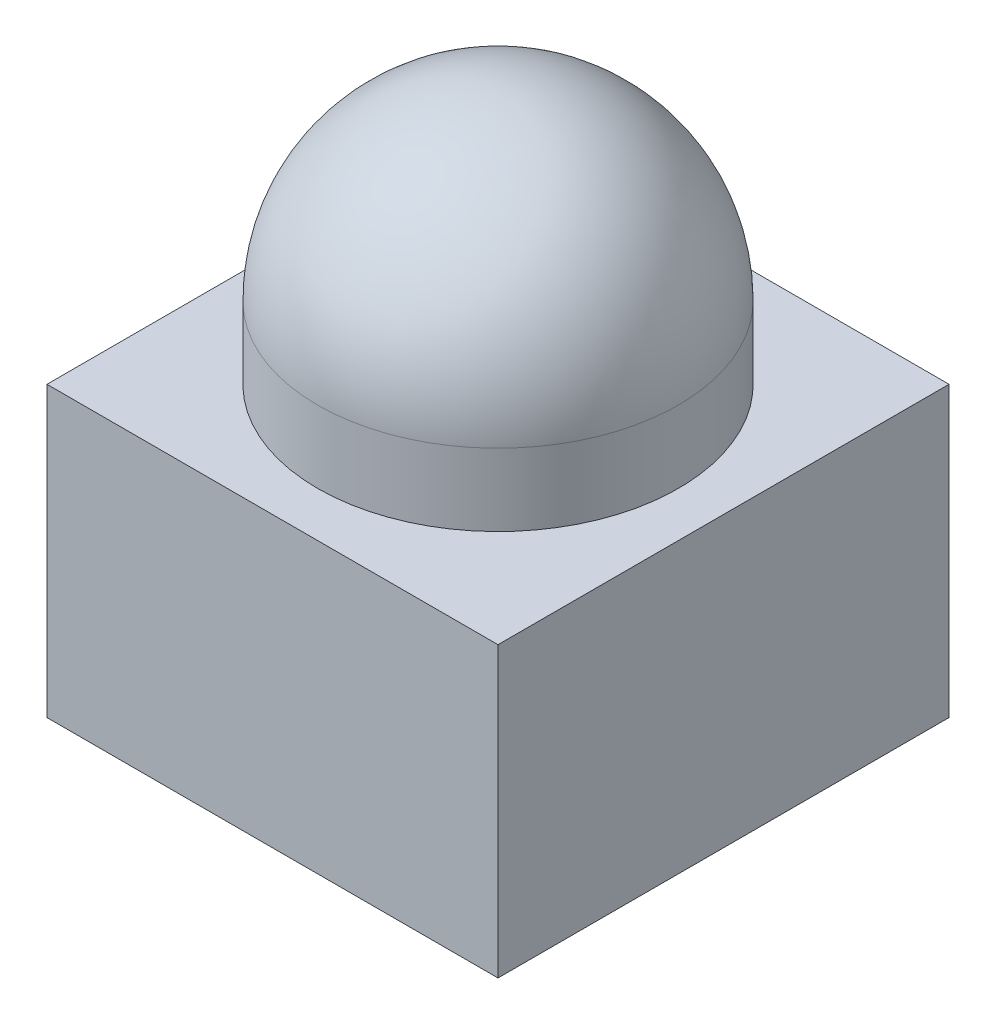
ISO-10303-21;
HEADER;
FILE_DESCRIPTION(('STEP AP214'),'2;1');
FILE_NAME('part.step','',(''),(''),'','','');
FILE_SCHEMA(('AUTOMOTIVE_DESIGN { 1 0 10303 214 1 1 1 1 }'));
ENDSEC;
DATA;
#1=APPLICATION_CONTEXT('core data for automotive mechanical design processes');
#2=APPLICATION_PROTOCOL_DEFINITION('international standard','automotive_design',2000,#1);
#3=PRODUCT_CONTEXT('',#1,'mechanical');
#4=PRODUCT('Part','Part','',(#3));
#5=PRODUCT_RELATED_PRODUCT_CATEGORY('part','',(#4));
#6=PRODUCT_DEFINITION_FORMATION('','',#4);
#7=PRODUCT_DEFINITION_CONTEXT('part definition',#1,'design');
#8=PRODUCT_DEFINITION('design','',#6,#7);
#9=PRODUCT_DEFINITION_SHAPE('','',#8);
#10=(LENGTH_UNIT() NAMED_UNIT(*) SI_UNIT(.MILLI.,.METRE.));
#11=(NAMED_UNIT(*) PLANE_ANGLE_UNIT() SI_UNIT($,.RADIAN.));
#12=(NAMED_UNIT(*) SI_UNIT($,.STERADIAN.) SOLID_ANGLE_UNIT());
#13=UNCERTAINTY_MEASURE_WITH_UNIT(LENGTH_MEASURE(1.E-05),#10,'distance_accuracy_value','');
#14=(GEOMETRIC_REPRESENTATION_CONTEXT(3) GLOBAL_UNCERTAINTY_ASSIGNED_CONTEXT((#13)) GLOBAL_UNIT_ASSIGNED_CONTEXT((#10,
#11,#12)) REPRESENTATION_CONTEXT('',''));
#15=CARTESIAN_POINT('',(0.,0.,0.));
#16=DIRECTION('',(0.,0.,1.));
#17=DIRECTION('',(1.,0.,0.));
#18=AXIS2_PLACEMENT_3D('',#15,#16,#17);
#19=CARTESIAN_POINT('',(0.,1.6,0.));
#20=DIRECTION('',(1.,0.,0.));
#21=DIRECTION('',(0.,0.,-1.));
#22=AXIS2_PLACEMENT_3D('',#19,#20,#21);
#23=PLANE('',#22);
#24=DIRECTION('',(0.,0.,1.));
#25=VECTOR('',#24,1.);
#26=CARTESIAN_POINT('',(0.,0.,0.));
#27=LINE('',#26,#25);
#28=CARTESIAN_POINT('',(0.,0.,-2.5));
#29=VERTEX_POINT('',#28);
#30=CARTESIAN_POINT('',(0.,0.,0.));
#31=VERTEX_POINT('',#30);
#32=EDGE_CURVE('E103',#29,#31,#27,.T.);
#33=ORIENTED_EDGE('',*,*,#32,.T.);
#34=DIRECTION('',(0.,-1.,0.));
#35=VECTOR('',#34,1.);
#36=CARTESIAN_POINT('',(0.,1.6,0.));
#37=LINE('',#36,#35);
#38=CARTESIAN_POINT('',(0.,1.6,0.));
#39=VERTEX_POINT('',#38);
#40=EDGE_CURVE('E94',#39,#31,#37,.T.);
#41=ORIENTED_EDGE('',*,*,#40,.F.);
#42=DIRECTION('',(0.,0.,1.));
#43=VECTOR('',#42,1.);
#44=CARTESIAN_POINT('',(0.,1.6,0.));
#45=LINE('',#44,#43);
#46=CARTESIAN_POINT('',(0.,1.6,-2.5));
#47=VERTEX_POINT('',#46);
#48=EDGE_CURVE('E88',#47,#39,#45,.T.);
#49=ORIENTED_EDGE('',*,*,#48,.F.);
#50=DIRECTION('',(0.,-1.,0.));
#51=VECTOR('',#50,1.);
#52=CARTESIAN_POINT('',(0.,1.6,-2.5));
#53=LINE('',#52,#51);
#54=EDGE_CURVE('E99',#47,#29,#53,.T.);
#55=ORIENTED_EDGE('',*,*,#54,.T.);
#56=EDGE_LOOP('',(#33,#41,#49,#55));
#57=FACE_BOUND('',#56,.T.);
#58=ADVANCED_FACE('F35',(#57),#23,.F.);
#59=CARTESIAN_POINT('',(0.,1.6,0.));
#60=DIRECTION('',(0.,0.,-1.));
#61=DIRECTION('',(-1.,0.,0.));
#62=AXIS2_PLACEMENT_3D('',#59,#60,#61);
#63=PLANE('',#62);
#64=DIRECTION('',(1.,0.,0.));
#65=VECTOR('',#64,1.);
#66=CARTESIAN_POINT('',(0.,0.,0.));
#67=LINE('',#66,#65);
#68=CARTESIAN_POINT('',(2.5,0.,0.));
#69=VERTEX_POINT('',#68);
#70=EDGE_CURVE('E93',#31,#69,#67,.T.);
#71=ORIENTED_EDGE('',*,*,#70,.T.);
#72=DIRECTION('',(0.,-1.,0.));
#73=VECTOR('',#72,1.);
#74=CARTESIAN_POINT('',(2.5,1.6,0.));
#75=LINE('',#74,#73);
#76=CARTESIAN_POINT('',(2.5,1.6,0.));
#77=VERTEX_POINT('',#76);
#78=EDGE_CURVE('E91',#77,#69,#75,.T.);
#79=ORIENTED_EDGE('',*,*,#78,.F.);
#80=DIRECTION('',(1.,0.,0.));
#81=VECTOR('',#80,1.);
#82=CARTESIAN_POINT('',(0.,1.6,0.));
#83=LINE('',#82,#81);
#84=EDGE_CURVE('E83',#39,#77,#83,.T.);
#85=ORIENTED_EDGE('',*,*,#84,.F.);
#86=ORIENTED_EDGE('',*,*,#40,.T.);
#87=EDGE_LOOP('',(#71,#79,#85,#86));
#88=FACE_BOUND('',#87,.T.);
#89=ADVANCED_FACE('F92',(#88),#63,.F.);
#90=CARTESIAN_POINT('',(2.5,1.6,0.));
#91=DIRECTION('',(-1.,0.,0.));
#92=DIRECTION('',(0.,0.,1.));
#93=AXIS2_PLACEMENT_3D('',#90,#91,#92);
#94=PLANE('',#93);
#95=DIRECTION('',(0.,0.,-1.));
#96=VECTOR('',#95,1.);
#97=CARTESIAN_POINT('',(2.5,0.,0.));
#98=LINE('',#97,#96);
#99=CARTESIAN_POINT('',(2.5,0.,-2.5));
#100=VERTEX_POINT('',#99);
#101=EDGE_CURVE('E69',#69,#100,#98,.T.);
#102=ORIENTED_EDGE('',*,*,#101,.T.);
#103=DIRECTION('',(0.,-1.,0.));
#104=VECTOR('',#103,1.);
#105=CARTESIAN_POINT('',(2.5,1.6,-2.5));
#106=LINE('',#105,#104);
#107=CARTESIAN_POINT('',(2.5,1.6,-2.5));
#108=VERTEX_POINT('',#107);
#109=EDGE_CURVE('E95',#108,#100,#106,.T.);
#110=ORIENTED_EDGE('',*,*,#109,.F.);
#111=DIRECTION('',(0.,0.,-1.));
#112=VECTOR('',#111,1.);
#113=CARTESIAN_POINT('',(2.5,1.6,0.));
#114=LINE('',#113,#112);
#115=EDGE_CURVE('E86',#77,#108,#114,.T.);
#116=ORIENTED_EDGE('',*,*,#115,.F.);
#117=ORIENTED_EDGE('',*,*,#78,.T.);
#118=EDGE_LOOP('',(#102,#110,#116,#117));
#119=FACE_BOUND('',#118,.T.);
#120=ADVANCED_FACE('F97',(#119),#94,.F.);
#121=CARTESIAN_POINT('',(0.,1.6,-2.5));
#122=DIRECTION('',(0.,0.,1.));
#123=DIRECTION('',(1.,0.,0.));
#124=AXIS2_PLACEMENT_3D('',#121,#122,#123);
#125=PLANE('',#124);
#126=DIRECTION('',(-1.,0.,0.));
#127=VECTOR('',#126,1.);
#128=CARTESIAN_POINT('',(0.,0.,-2.5));
#129=LINE('',#128,#127);
#130=EDGE_CURVE('E75',#100,#29,#129,.T.);
#131=ORIENTED_EDGE('',*,*,#130,.T.);
#132=ORIENTED_EDGE('',*,*,#54,.F.);
#133=DIRECTION('',(-1.,0.,0.));
#134=VECTOR('',#133,1.);
#135=CARTESIAN_POINT('',(0.,1.6,-2.5));
#136=LINE('',#135,#134);
#137=EDGE_CURVE('E52',#108,#47,#136,.T.);
#138=ORIENTED_EDGE('',*,*,#137,.F.);
#139=ORIENTED_EDGE('',*,*,#109,.T.);
#140=EDGE_LOOP('',(#131,#132,#138,#139));
#141=FACE_BOUND('',#140,.T.);
#142=ADVANCED_FACE('F118',(#141),#125,.F.);
#143=CARTESIAN_POINT('',(0.,1.6,0.));
#144=DIRECTION('',(0.,-1.,0.));
#145=DIRECTION('',(0.,0.,-1.));
#146=AXIS2_PLACEMENT_3D('',#143,#144,#145);
#147=PLANE('',#146);
#148=CARTESIAN_POINT('',(1.25,1.6,-1.25));
#149=DIRECTION('',(0.,1.,0.));
#150=DIRECTION('',(0.,0.,1.));
#151=AXIS2_PLACEMENT_3D('',#148,#149,#150);
#152=CIRCLE('',#151,1.);
#153=CARTESIAN_POINT('',(1.25,1.6,-0.25));
#154=VERTEX_POINT('',#153);
#155=EDGE_CURVE('E44',#154,#154,#152,.T.);
#156=ORIENTED_EDGE('',*,*,#155,.F.);
#157=EDGE_LOOP('',(#156));
#158=FACE_BOUND('',#157,.T.);
#159=ORIENTED_EDGE('',*,*,#48,.T.);
#160=ORIENTED_EDGE('',*,*,#84,.T.);
#161=ORIENTED_EDGE('',*,*,#115,.T.);
#162=ORIENTED_EDGE('',*,*,#137,.T.);
#163=EDGE_LOOP('',(#159,#160,#161,#162));
#164=FACE_BOUND('',#163,.T.);
#165=ADVANCED_FACE('F84',(#158,#164),#147,.F.);
#166=CARTESIAN_POINT('',(0.,0.,0.));
#167=DIRECTION('',(0.,-1.,0.));
#168=DIRECTION('',(0.,0.,-1.));
#169=AXIS2_PLACEMENT_3D('',#166,#167,#168);
#170=PLANE('',#169);
#171=ORIENTED_EDGE('',*,*,#32,.F.);
#172=ORIENTED_EDGE('',*,*,#130,.F.);
#173=ORIENTED_EDGE('',*,*,#101,.F.);
#174=ORIENTED_EDGE('',*,*,#70,.F.);
#175=EDGE_LOOP('',(#171,#172,#173,#174));
#176=FACE_BOUND('',#175,.T.);
#177=ADVANCED_FACE('F117',(#176),#170,.T.);
#178=CARTESIAN_POINT('',(1.25,3.,-1.25));
#179=DIRECTION('',(0.,-1.,0.));
#180=DIRECTION('',(0.,0.,-1.));
#181=AXIS2_PLACEMENT_3D('',#178,#179,#180);
#182=CYLINDRICAL_SURFACE('',#181,1.);
#183=CARTESIAN_POINT('',(1.25,2.,-1.25));
#184=DIRECTION('',(0.,-1.,0.));
#185=DIRECTION('',(0.,0.,-1.));
#186=AXIS2_PLACEMENT_3D('',#183,#184,#185);
#187=CIRCLE('',#186,1.);
#188=CARTESIAN_POINT('',(1.25,2.,-2.25));
#189=VERTEX_POINT('',#188);
#190=EDGE_CURVE('E11',#189,#189,#187,.T.);
#191=ORIENTED_EDGE('',*,*,#190,.T.);
#192=EDGE_LOOP('',(#191));
#193=FACE_BOUND('',#192,.T.);
#194=ORIENTED_EDGE('',*,*,#155,.T.);
#195=EDGE_LOOP('',(#194));
#196=FACE_BOUND('',#195,.T.);
#197=ADVANCED_FACE('F114',(#193,#196),#182,.T.);
#198=CARTESIAN_POINT('',(1.25,2.,-1.25));
#199=DIRECTION('',(0.,1.,0.));
#200=DIRECTION('',(0.,0.,1.));
#201=AXIS2_PLACEMENT_3D('',#198,#199,#200);
#202=SPHERICAL_SURFACE('',#201,1.);
#203=ORIENTED_EDGE('',*,*,#190,.F.);
#204=EDGE_LOOP('',(#203));
#205=FACE_BOUND('',#204,.T.);
#206=ADVANCED_FACE('F37',(#205),#202,.T.);
#207=CLOSED_SHELL('',(#58,#89,#120,#142,#165,#177,#197,#206));
#208=MANIFOLD_SOLID_BREP('B2',#207);
#209=ADVANCED_BREP_SHAPE_REPRESENTATION('',(#18,#208),#14);
#210=SHAPE_DEFINITION_REPRESENTATION(#9,#209);
ENDSEC;
END-ISO-10303-21;
